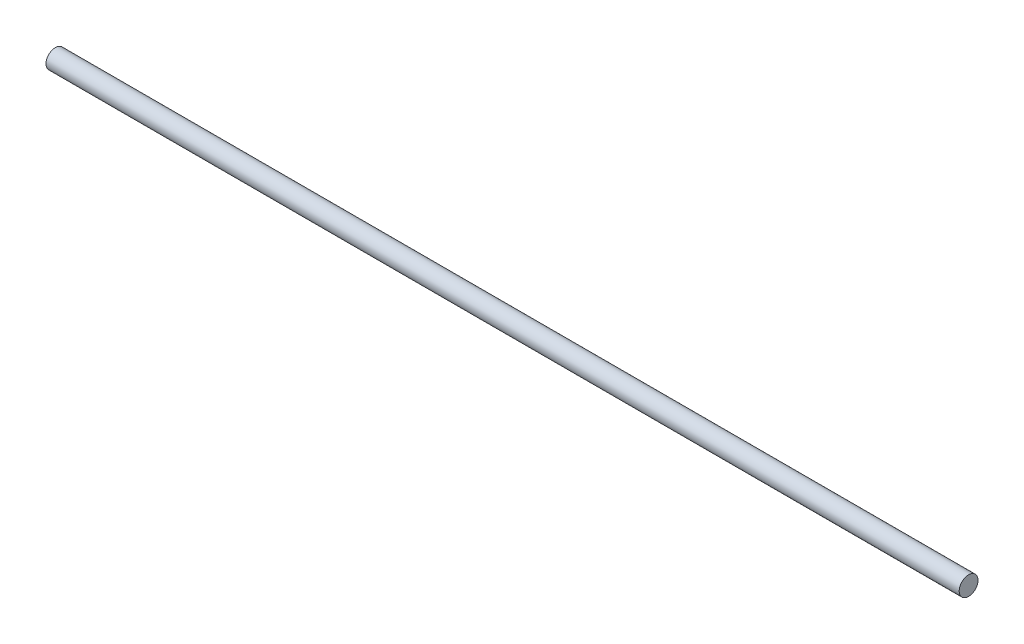
ISO-10303-21;
HEADER;
FILE_DESCRIPTION(('STEP AP214'),'2;1');
FILE_NAME('part.step','',(''),(''),'','','');
FILE_SCHEMA(('AUTOMOTIVE_DESIGN { 1 0 10303 214 1 1 1 1 }'));
ENDSEC;
DATA;
#1=APPLICATION_CONTEXT('core data for automotive mechanical design processes');
#2=APPLICATION_PROTOCOL_DEFINITION('international standard','automotive_design',2000,#1);
#3=PRODUCT_CONTEXT('',#1,'mechanical');
#4=PRODUCT('Part','Part','',(#3));
#5=PRODUCT_RELATED_PRODUCT_CATEGORY('part','',(#4));
#6=PRODUCT_DEFINITION_FORMATION('','',#4);
#7=PRODUCT_DEFINITION_CONTEXT('part definition',#1,'design');
#8=PRODUCT_DEFINITION('design','',#6,#7);
#9=PRODUCT_DEFINITION_SHAPE('','',#8);
#10=(LENGTH_UNIT() NAMED_UNIT(*) SI_UNIT(.MILLI.,.METRE.));
#11=(NAMED_UNIT(*) PLANE_ANGLE_UNIT() SI_UNIT($,.RADIAN.));
#12=(NAMED_UNIT(*) SI_UNIT($,.STERADIAN.) SOLID_ANGLE_UNIT());
#13=UNCERTAINTY_MEASURE_WITH_UNIT(LENGTH_MEASURE(1.E-05),#10,'distance_accuracy_value','');
#14=(GEOMETRIC_REPRESENTATION_CONTEXT(3) GLOBAL_UNCERTAINTY_ASSIGNED_CONTEXT((#13)) GLOBAL_UNIT_ASSIGNED_CONTEXT((#10,
#11,#12)) REPRESENTATION_CONTEXT('',''));
#15=CARTESIAN_POINT('',(0.,0.,0.));
#16=DIRECTION('',(0.,0.,1.));
#17=DIRECTION('',(1.,0.,0.));
#18=AXIS2_PLACEMENT_3D('',#15,#16,#17);
#19=CARTESIAN_POINT('',(0.,0.,0.));
#20=DIRECTION('',(-1.,0.,0.));
#21=DIRECTION('',(0.,0.,1.));
#22=AXIS2_PLACEMENT_3D('',#19,#20,#21);
#23=PLANE('',#22);
#24=CARTESIAN_POINT('',(0.,0.,0.));
#25=DIRECTION('',(1.,0.,0.));
#26=DIRECTION('',(0.,0.,-1.));
#27=AXIS2_PLACEMENT_3D('',#24,#25,#26);
#28=CIRCLE('',#27,2.25);
#29=CARTESIAN_POINT('',(0.,0.,-2.25));
#30=VERTEX_POINT('',#29);
#31=EDGE_CURVE('E10',#30,#30,#28,.T.);
#32=ORIENTED_EDGE('',*,*,#31,.F.);
#33=EDGE_LOOP('',(#32));
#34=FACE_BOUND('',#33,.T.);
#35=ADVANCED_FACE('F37',(#34),#23,.T.);
#36=CARTESIAN_POINT('',(0.,0.,0.));
#37=DIRECTION('',(1.,0.,0.));
#38=DIRECTION('',(0.,0.,-1.));
#39=AXIS2_PLACEMENT_3D('',#36,#37,#38);
#40=CYLINDRICAL_SURFACE('',#39,2.25);
#41=ORIENTED_EDGE('',*,*,#31,.T.);
#42=EDGE_LOOP('',(#41));
#43=FACE_BOUND('',#42,.T.);
#44=CARTESIAN_POINT('',(218.5,0.,0.));
#45=DIRECTION('',(1.,0.,0.));
#46=DIRECTION('',(0.,0.,-1.));
#47=AXIS2_PLACEMENT_3D('',#44,#45,#46);
#48=CIRCLE('',#47,2.25);
#49=CARTESIAN_POINT('',(218.5,0.,-2.25));
#50=VERTEX_POINT('',#49);
#51=EDGE_CURVE('E43',#50,#50,#48,.T.);
#52=ORIENTED_EDGE('',*,*,#51,.F.);
#53=EDGE_LOOP('',(#52));
#54=FACE_BOUND('',#53,.T.);
#55=ADVANCED_FACE('F51',(#43,#54),#40,.T.);
#56=CARTESIAN_POINT('',(218.5,0.,0.));
#57=DIRECTION('',(1.,0.,0.));
#58=DIRECTION('',(0.,0.,-1.));
#59=AXIS2_PLACEMENT_3D('',#56,#57,#58);
#60=PLANE('',#59);
#61=ORIENTED_EDGE('',*,*,#51,.T.);
#62=EDGE_LOOP('',(#61));
#63=FACE_BOUND('',#62,.T.);
#64=ADVANCED_FACE('F49',(#63),#60,.T.);
#65=CLOSED_SHELL('',(#35,#55,#64));
#66=MANIFOLD_SOLID_BREP('B2',#65);
#67=ADVANCED_BREP_SHAPE_REPRESENTATION('',(#18,#66),#14);
#68=SHAPE_DEFINITION_REPRESENTATION(#9,#67);
ENDSEC;
END-ISO-10303-21;
